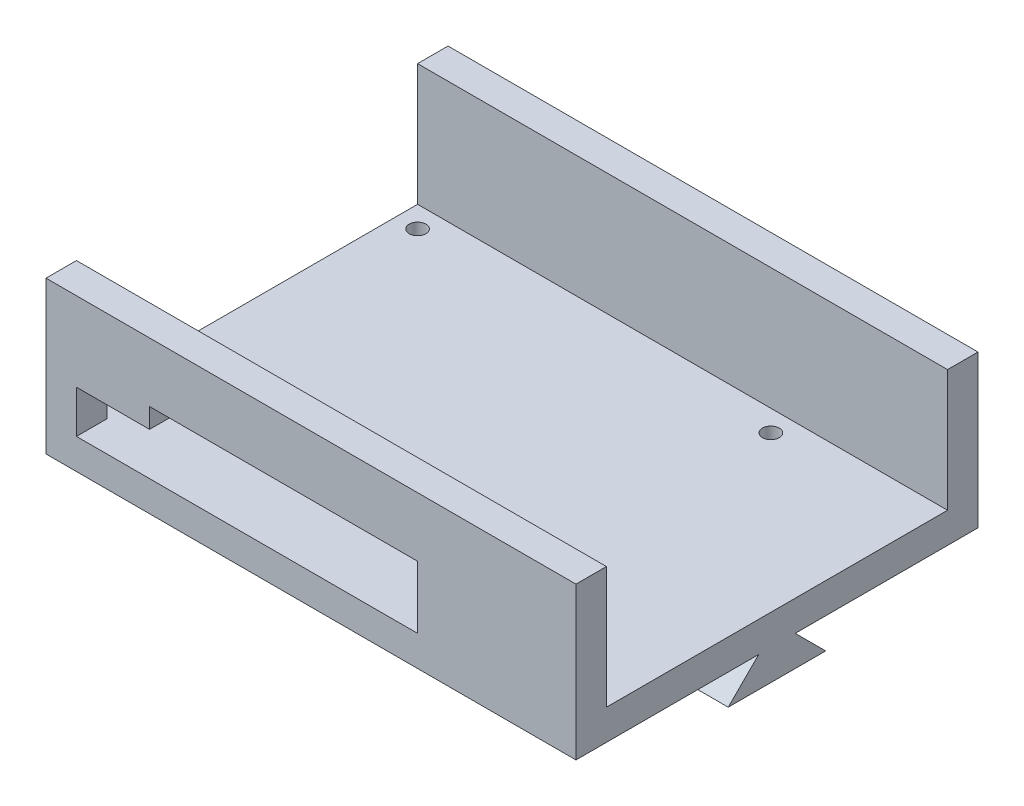
ISO-10303-21;
HEADER;
FILE_DESCRIPTION(('STEP AP214'),'2;1');
FILE_NAME('part.step','',(''),(''),'','','');
FILE_SCHEMA(('AUTOMOTIVE_DESIGN { 1 0 10303 214 1 1 1 1 }'));
ENDSEC;
DATA;
#1=APPLICATION_CONTEXT('core data for automotive mechanical design processes');
#2=APPLICATION_PROTOCOL_DEFINITION('international standard','automotive_design',2000,#1);
#3=PRODUCT_CONTEXT('',#1,'mechanical');
#4=PRODUCT('Part','Part','',(#3));
#5=PRODUCT_RELATED_PRODUCT_CATEGORY('part','',(#4));
#6=PRODUCT_DEFINITION_FORMATION('','',#4);
#7=PRODUCT_DEFINITION_CONTEXT('part definition',#1,'design');
#8=PRODUCT_DEFINITION('design','',#6,#7);
#9=PRODUCT_DEFINITION_SHAPE('','',#8);
#10=(LENGTH_UNIT() NAMED_UNIT(*) SI_UNIT(.MILLI.,.METRE.));
#11=(NAMED_UNIT(*) PLANE_ANGLE_UNIT() SI_UNIT($,.RADIAN.));
#12=(NAMED_UNIT(*) SI_UNIT($,.STERADIAN.) SOLID_ANGLE_UNIT());
#13=UNCERTAINTY_MEASURE_WITH_UNIT(LENGTH_MEASURE(1.E-05),#10,'distance_accuracy_value','');
#14=(GEOMETRIC_REPRESENTATION_CONTEXT(3) GLOBAL_UNCERTAINTY_ASSIGNED_CONTEXT((#13)) GLOBAL_UNIT_ASSIGNED_CONTEXT((#10,
#11,#12)) REPRESENTATION_CONTEXT('',''));
#15=CARTESIAN_POINT('',(0.,0.,0.));
#16=DIRECTION('',(0.,0.,1.));
#17=DIRECTION('',(1.,0.,0.));
#18=AXIS2_PLACEMENT_3D('',#15,#16,#17);
#19=CARTESIAN_POINT('',(0.,10.,0.));
#20=DIRECTION('',(0.,1.,0.));
#21=DIRECTION('',(0.,0.,1.));
#22=AXIS2_PLACEMENT_3D('',#19,#20,#21);
#23=PLANE('',#22);
#24=DIRECTION('',(-1.,0.,0.));
#25=VECTOR('',#24,1.);
#26=CARTESIAN_POINT('',(43.5,9.99999999999982,28.));
#27=LINE('',#26,#25);
#28=CARTESIAN_POINT('',(-38.5,9.99999999999994,28.));
#29=VERTEX_POINT('',#28);
#30=CARTESIAN_POINT('',(-43.5,10.,28.));
#31=VERTEX_POINT('',#30);
#32=EDGE_CURVE('E215',#29,#31,#27,.T.);
#33=ORIENTED_EDGE('',*,*,#32,.F.);
#34=DIRECTION('',(0.,0.,1.));
#35=VECTOR('',#34,1.);
#36=CARTESIAN_POINT('',(-38.5,9.99999999999994,23.));
#37=LINE('',#36,#35);
#38=CARTESIAN_POINT('',(-38.5,9.99999999999993,33.));
#39=VERTEX_POINT('',#38);
#40=EDGE_CURVE('E173',#29,#39,#37,.T.);
#41=ORIENTED_EDGE('',*,*,#40,.T.);
#42=DIRECTION('',(1.,0.,0.));
#43=VECTOR('',#42,1.);
#44=CARTESIAN_POINT('',(17.5,9.99999999999994,33.));
#45=LINE('',#44,#43);
#46=CARTESIAN_POINT('',(17.5,9.99999999999994,33.));
#47=VERTEX_POINT('',#46);
#48=EDGE_CURVE('E170',#39,#47,#45,.T.);
#49=ORIENTED_EDGE('',*,*,#48,.T.);
#50=DIRECTION('',(0.,0.,1.));
#51=VECTOR('',#50,1.);
#52=CARTESIAN_POINT('',(17.5,9.99999999999994,23.));
#53=LINE('',#52,#51);
#54=CARTESIAN_POINT('',(17.5,9.99999999999982,28.));
#55=VERTEX_POINT('',#54);
#56=EDGE_CURVE('E58',#55,#47,#53,.T.);
#57=ORIENTED_EDGE('',*,*,#56,.F.);
#58=CARTESIAN_POINT('',(43.5,10.,28.));
#59=VERTEX_POINT('',#58);
#60=EDGE_CURVE('E216',#59,#55,#27,.T.);
#61=ORIENTED_EDGE('',*,*,#60,.F.);
#62=DIRECTION('',(0.,0.,-1.));
#63=VECTOR('',#62,1.);
#64=CARTESIAN_POINT('',(43.5,10.,-33.));
#65=LINE('',#64,#63);
#66=CARTESIAN_POINT('',(43.5,9.99999999999981,-28.));
#67=VERTEX_POINT('',#66);
#68=EDGE_CURVE('E240',#59,#67,#65,.T.);
#69=ORIENTED_EDGE('',*,*,#68,.T.);
#70=DIRECTION('',(-1.,0.,0.));
#71=VECTOR('',#70,1.);
#72=CARTESIAN_POINT('',(43.5,9.99999999999981,-28.));
#73=LINE('',#72,#71);
#74=CARTESIAN_POINT('',(-43.5,10.,-28.));
#75=VERTEX_POINT('',#74);
#76=EDGE_CURVE('E230',#67,#75,#73,.T.);
#77=ORIENTED_EDGE('',*,*,#76,.T.);
#78=DIRECTION('',(0.,0.,1.));
#79=VECTOR('',#78,1.);
#80=CARTESIAN_POINT('',(-43.5,10.,-33.));
#81=LINE('',#80,#79);
#82=EDGE_CURVE('E243',#75,#31,#81,.T.);
#83=ORIENTED_EDGE('',*,*,#82,.T.);
#84=EDGE_LOOP('',(#33,#41,#49,#57,#61,#69,#77,#83));
#85=FACE_BOUND('',#84,.T.);
#86=CARTESIAN_POINT('',(18.,10.,24.5));
#87=DIRECTION('',(0.,1.,0.));
#88=DIRECTION('',(0.,0.,1.));
#89=AXIS2_PLACEMENT_3D('',#86,#87,#88);
#90=CIRCLE('',#89,1.375);
#91=CARTESIAN_POINT('',(18.,10.,25.875));
#92=VERTEX_POINT('',#91);
#93=EDGE_CURVE('E314',#92,#92,#90,.T.);
#94=ORIENTED_EDGE('',*,*,#93,.F.);
#95=EDGE_LOOP('',(#94));
#96=FACE_BOUND('',#95,.T.);
#97=CARTESIAN_POINT('',(18.,10.,-24.5));
#98=DIRECTION('',(0.,1.,0.));
#99=DIRECTION('',(0.,0.,1.));
#100=AXIS2_PLACEMENT_3D('',#97,#98,#99);
#101=CIRCLE('',#100,1.375);
#102=CARTESIAN_POINT('',(18.,10.,-23.125));
#103=VERTEX_POINT('',#102);
#104=EDGE_CURVE('E331',#103,#103,#101,.T.);
#105=ORIENTED_EDGE('',*,*,#104,.F.);
#106=EDGE_LOOP('',(#105));
#107=FACE_BOUND('',#106,.T.);
#108=CARTESIAN_POINT('',(-40.,10.,-24.5));
#109=DIRECTION('',(0.,1.,0.));
#110=DIRECTION('',(0.,0.,1.));
#111=AXIS2_PLACEMENT_3D('',#108,#109,#110);
#112=CIRCLE('',#111,1.375);
#113=CARTESIAN_POINT('',(-40.,10.,-23.125));
#114=VERTEX_POINT('',#113);
#115=EDGE_CURVE('E249',#114,#114,#112,.T.);
#116=ORIENTED_EDGE('',*,*,#115,.F.);
#117=EDGE_LOOP('',(#116));
#118=FACE_BOUND('',#117,.T.);
#119=CARTESIAN_POINT('',(-40.,10.,24.5));
#120=DIRECTION('',(0.,1.,0.));
#121=DIRECTION('',(0.,0.,1.));
#122=AXIS2_PLACEMENT_3D('',#119,#120,#121);
#123=CIRCLE('',#122,1.375);
#124=CARTESIAN_POINT('',(-40.,10.,25.875));
#125=VERTEX_POINT('',#124);
#126=EDGE_CURVE('E333',#125,#125,#123,.T.);
#127=ORIENTED_EDGE('',*,*,#126,.F.);
#128=EDGE_LOOP('',(#127));
#129=FACE_BOUND('',#128,.T.);
#130=ADVANCED_FACE('F35',(#85,#96,#107,#118,#129),#23,.T.);
#131=CARTESIAN_POINT('',(0.,0.,0.));
#132=DIRECTION('',(0.,1.,0.));
#133=DIRECTION('',(0.,0.,1.));
#134=AXIS2_PLACEMENT_3D('',#131,#132,#133);
#135=PLANE('',#134);
#136=DIRECTION('',(0.,0.,-1.));
#137=VECTOR('',#136,1.);
#138=CARTESIAN_POINT('',(43.5,0.,-33.));
#139=LINE('',#138,#137);
#140=CARTESIAN_POINT('',(43.5,-1.19770966961526E-12,8.00000000000604));
#141=VERTEX_POINT('',#140);
#142=CARTESIAN_POINT('',(43.5,0.,-7.99999999999396));
#143=VERTEX_POINT('',#142);
#144=EDGE_CURVE('E253',#141,#143,#139,.T.);
#145=ORIENTED_EDGE('',*,*,#144,.F.);
#146=DIRECTION('',(1.,0.,0.));
#147=VECTOR('',#146,1.);
#148=CARTESIAN_POINT('',(-43.5,-1.19770966961526E-12,8.00000000000604));
#149=LINE('',#148,#147);
#150=CARTESIAN_POINT('',(-43.5,-1.19770966961526E-12,8.00000000000604));
#151=VERTEX_POINT('',#150);
#152=EDGE_CURVE('E357',#151,#141,#149,.T.);
#153=ORIENTED_EDGE('',*,*,#152,.F.);
#154=DIRECTION('',(0.,0.,1.));
#155=VECTOR('',#154,1.);
#156=CARTESIAN_POINT('',(-43.5,0.,-33.));
#157=LINE('',#156,#155);
#158=CARTESIAN_POINT('',(-43.5,0.,-7.99999999999396));
#159=VERTEX_POINT('',#158);
#160=EDGE_CURVE('E244',#159,#151,#157,.T.);
#161=ORIENTED_EDGE('',*,*,#160,.F.);
#162=DIRECTION('',(1.,0.,0.));
#163=VECTOR('',#162,1.);
#164=CARTESIAN_POINT('',(-43.5,0.,-7.99999999999396));
#165=LINE('',#164,#163);
#166=EDGE_CURVE('E310',#159,#143,#165,.T.);
#167=ORIENTED_EDGE('',*,*,#166,.T.);
#168=EDGE_LOOP('',(#145,#153,#161,#167));
#169=FACE_BOUND('',#168,.T.);
#170=ADVANCED_FACE('F379',(#169),#135,.F.);
#171=CARTESIAN_POINT('',(43.5,10.,-33.));
#172=DIRECTION('',(-1.,0.,0.));
#173=DIRECTION('',(0.,0.,1.));
#174=AXIS2_PLACEMENT_3D('',#171,#172,#173);
#175=PLANE('',#174);
#176=DIRECTION('',(0.,-1.,0.));
#177=VECTOR('',#176,1.);
#178=CARTESIAN_POINT('',(43.5,10.,33.));
#179=LINE('',#178,#177);
#180=CARTESIAN_POINT('',(43.5,30.,33.));
#181=VERTEX_POINT('',#180);
#182=CARTESIAN_POINT('',(43.5,5.,33.));
#183=VERTEX_POINT('',#182);
#184=EDGE_CURVE('E258',#181,#183,#179,.T.);
#185=ORIENTED_EDGE('',*,*,#184,.T.);
#186=DIRECTION('',(0.,0.,1.));
#187=VECTOR('',#186,1.);
#188=CARTESIAN_POINT('',(43.5,5.,33.));
#189=LINE('',#188,#187);
#190=CARTESIAN_POINT('',(43.5,5.,3.));
#191=VERTEX_POINT('',#190);
#192=EDGE_CURVE('E361',#191,#183,#189,.T.);
#193=ORIENTED_EDGE('',*,*,#192,.F.);
#194=DIRECTION('',(0.,0.707106781186205,-0.70710678118689));
#195=VECTOR('',#194,1.);
#196=CARTESIAN_POINT('',(43.5,5.,3.));
#197=LINE('',#196,#195);
#198=EDGE_CURVE('E383',#141,#191,#197,.T.);
#199=ORIENTED_EDGE('',*,*,#198,.F.);
#200=ORIENTED_EDGE('',*,*,#144,.T.);
#201=DIRECTION('',(0.,-0.707106781186975,-0.70710678118612));
#202=VECTOR('',#201,1.);
#203=CARTESIAN_POINT('',(43.5,5.,-3.));
#204=LINE('',#203,#202);
#205=CARTESIAN_POINT('',(43.5,5.,-3.));
#206=VERTEX_POINT('',#205);
#207=EDGE_CURVE('E373',#206,#143,#204,.T.);
#208=ORIENTED_EDGE('',*,*,#207,.F.);
#209=DIRECTION('',(0.,0.,1.));
#210=VECTOR('',#209,1.);
#211=CARTESIAN_POINT('',(43.5,5.,-33.));
#212=LINE('',#211,#210);
#213=CARTESIAN_POINT('',(43.5,5.,-33.));
#214=VERTEX_POINT('',#213);
#215=EDGE_CURVE('E370',#214,#206,#212,.T.);
#216=ORIENTED_EDGE('',*,*,#215,.F.);
#217=DIRECTION('',(0.,-1.,0.));
#218=VECTOR('',#217,1.);
#219=CARTESIAN_POINT('',(43.5,10.,-33.));
#220=LINE('',#219,#218);
#221=CARTESIAN_POINT('',(43.5,30.,-33.));
#222=VERTEX_POINT('',#221);
#223=EDGE_CURVE('E296',#222,#214,#220,.T.);
#224=ORIENTED_EDGE('',*,*,#223,.F.);
#225=DIRECTION('',(0.,0.,1.));
#226=VECTOR('',#225,1.);
#227=CARTESIAN_POINT('',(43.5,30.,-33.));
#228=LINE('',#227,#226);
#229=CARTESIAN_POINT('',(43.5,29.9999999999998,-28.));
#230=VERTEX_POINT('',#229);
#231=EDGE_CURVE('E222',#222,#230,#228,.T.);
#232=ORIENTED_EDGE('',*,*,#231,.T.);
#233=DIRECTION('',(0.,-1.,0.));
#234=VECTOR('',#233,1.);
#235=CARTESIAN_POINT('',(43.5,29.9999999999998,-28.));
#236=LINE('',#235,#234);
#237=EDGE_CURVE('E224',#230,#67,#236,.T.);
#238=ORIENTED_EDGE('',*,*,#237,.T.);
#239=ORIENTED_EDGE('',*,*,#68,.F.);
#240=DIRECTION('',(0.,1.,0.));
#241=VECTOR('',#240,1.);
#242=CARTESIAN_POINT('',(43.5,30.,28.));
#243=LINE('',#242,#241);
#244=CARTESIAN_POINT('',(43.5,30.,28.));
#245=VERTEX_POINT('',#244);
#246=EDGE_CURVE('E205',#59,#245,#243,.T.);
#247=ORIENTED_EDGE('',*,*,#246,.T.);
#248=DIRECTION('',(0.,0.,1.));
#249=VECTOR('',#248,1.);
#250=CARTESIAN_POINT('',(43.5,30.,33.));
#251=LINE('',#250,#249);
#252=EDGE_CURVE('E207',#245,#181,#251,.T.);
#253=ORIENTED_EDGE('',*,*,#252,.T.);
#254=EDGE_LOOP('',(#185,#193,#199,#200,#208,#216,#224,#232,#238,#239,#247,#253));
#255=FACE_BOUND('',#254,.T.);
#256=ADVANCED_FACE('F37',(#255),#175,.F.);
#257=CARTESIAN_POINT('',(-43.5,10.,-33.));
#258=DIRECTION('',(0.,0.,1.));
#259=DIRECTION('',(1.,0.,0.));
#260=AXIS2_PLACEMENT_3D('',#257,#258,#259);
#261=PLANE('',#260);
#262=ORIENTED_EDGE('',*,*,#223,.T.);
#263=DIRECTION('',(1.,0.,0.));
#264=VECTOR('',#263,1.);
#265=CARTESIAN_POINT('',(-43.5,5.,-33.));
#266=LINE('',#265,#264);
#267=CARTESIAN_POINT('',(-43.5,5.,-33.));
#268=VERTEX_POINT('',#267);
#269=EDGE_CURVE('E322',#268,#214,#266,.T.);
#270=ORIENTED_EDGE('',*,*,#269,.F.);
#271=DIRECTION('',(0.,-1.,0.));
#272=VECTOR('',#271,1.);
#273=CARTESIAN_POINT('',(-43.5,10.,-33.));
#274=LINE('',#273,#272);
#275=CARTESIAN_POINT('',(-43.5,30.,-33.));
#276=VERTEX_POINT('',#275);
#277=EDGE_CURVE('E298',#276,#268,#274,.T.);
#278=ORIENTED_EDGE('',*,*,#277,.F.);
#279=DIRECTION('',(-1.,0.,0.));
#280=VECTOR('',#279,1.);
#281=CARTESIAN_POINT('',(43.5,30.,-33.));
#282=LINE('',#281,#280);
#283=EDGE_CURVE('E385',#222,#276,#282,.T.);
#284=ORIENTED_EDGE('',*,*,#283,.F.);
#285=EDGE_LOOP('',(#262,#270,#278,#284));
#286=FACE_BOUND('',#285,.T.);
#287=ADVANCED_FACE('F391',(#286),#261,.F.);
#288=CARTESIAN_POINT('',(-43.5,10.,-33.));
#289=DIRECTION('',(1.,0.,0.));
#290=DIRECTION('',(0.,0.,-1.));
#291=AXIS2_PLACEMENT_3D('',#288,#289,#290);
#292=PLANE('',#291);
#293=DIRECTION('',(0.,0.707106781186205,-0.70710678118689));
#294=VECTOR('',#293,1.);
#295=CARTESIAN_POINT('',(-43.5,5.,3.));
#296=LINE('',#295,#294);
#297=CARTESIAN_POINT('',(-43.5,5.,3.));
#298=VERTEX_POINT('',#297);
#299=EDGE_CURVE('E355',#151,#298,#296,.T.);
#300=ORIENTED_EDGE('',*,*,#299,.T.);
#301=DIRECTION('',(0.,0.,1.));
#302=VECTOR('',#301,1.);
#303=CARTESIAN_POINT('',(-43.5,5.,33.));
#304=LINE('',#303,#302);
#305=CARTESIAN_POINT('',(-43.5,5.,33.));
#306=VERTEX_POINT('',#305);
#307=EDGE_CURVE('E354',#298,#306,#304,.T.);
#308=ORIENTED_EDGE('',*,*,#307,.T.);
#309=DIRECTION('',(0.,-1.,0.));
#310=VECTOR('',#309,1.);
#311=CARTESIAN_POINT('',(-43.5,10.,33.));
#312=LINE('',#311,#310);
#313=CARTESIAN_POINT('',(-43.5,30.,33.));
#314=VERTEX_POINT('',#313);
#315=EDGE_CURVE('E304',#314,#306,#312,.T.);
#316=ORIENTED_EDGE('',*,*,#315,.F.);
#317=DIRECTION('',(0.,0.,1.));
#318=VECTOR('',#317,1.);
#319=CARTESIAN_POINT('',(-43.5,30.,33.));
#320=LINE('',#319,#318);
#321=CARTESIAN_POINT('',(-43.5,30.,28.));
#322=VERTEX_POINT('',#321);
#323=EDGE_CURVE('E202',#322,#314,#320,.T.);
#324=ORIENTED_EDGE('',*,*,#323,.F.);
#325=DIRECTION('',(0.,1.,0.));
#326=VECTOR('',#325,1.);
#327=CARTESIAN_POINT('',(-43.5,30.,28.));
#328=LINE('',#327,#326);
#329=EDGE_CURVE('E192',#31,#322,#328,.T.);
#330=ORIENTED_EDGE('',*,*,#329,.F.);
#331=ORIENTED_EDGE('',*,*,#82,.F.);
#332=DIRECTION('',(0.,-1.,0.));
#333=VECTOR('',#332,1.);
#334=CARTESIAN_POINT('',(-43.5,29.9999999999998,-28.));
#335=LINE('',#334,#333);
#336=CARTESIAN_POINT('',(-43.5,29.9999999999998,-28.));
#337=VERTEX_POINT('',#336);
#338=EDGE_CURVE('E221',#337,#75,#335,.T.);
#339=ORIENTED_EDGE('',*,*,#338,.F.);
#340=DIRECTION('',(0.,0.,1.));
#341=VECTOR('',#340,1.);
#342=CARTESIAN_POINT('',(-43.5,30.,-33.));
#343=LINE('',#342,#341);
#344=EDGE_CURVE('E218',#276,#337,#343,.T.);
#345=ORIENTED_EDGE('',*,*,#344,.F.);
#346=ORIENTED_EDGE('',*,*,#277,.T.);
#347=DIRECTION('',(0.,0.,1.));
#348=VECTOR('',#347,1.);
#349=CARTESIAN_POINT('',(-43.5,5.,-33.));
#350=LINE('',#349,#348);
#351=CARTESIAN_POINT('',(-43.5,5.,-3.));
#352=VERTEX_POINT('',#351);
#353=EDGE_CURVE('E374',#268,#352,#350,.T.);
#354=ORIENTED_EDGE('',*,*,#353,.T.);
#355=DIRECTION('',(0.,-0.707106781186975,-0.70710678118612));
#356=VECTOR('',#355,1.);
#357=CARTESIAN_POINT('',(-43.5,5.,-3.));
#358=LINE('',#357,#356);
#359=EDGE_CURVE('E325',#352,#159,#358,.T.);
#360=ORIENTED_EDGE('',*,*,#359,.T.);
#361=ORIENTED_EDGE('',*,*,#160,.T.);
#362=EDGE_LOOP('',(#300,#308,#316,#324,#330,#331,#339,#345,#346,#354,#360,#361));
#363=FACE_BOUND('',#362,.T.);
#364=ADVANCED_FACE('F273',(#363),#292,.F.);
#365=CARTESIAN_POINT('',(-43.5,10.,33.));
#366=DIRECTION('',(0.,0.,-1.));
#367=DIRECTION('',(-1.,0.,0.));
#368=AXIS2_PLACEMENT_3D('',#365,#366,#367);
#369=PLANE('',#368);
#370=ORIENTED_EDGE('',*,*,#48,.F.);
#371=DIRECTION('',(0.,-1.,0.));
#372=VECTOR('',#371,1.);
#373=CARTESIAN_POINT('',(-38.5,9.99999999999994,33.));
#374=LINE('',#373,#372);
#375=CARTESIAN_POINT('',(-38.5,16.9999999999999,33.));
#376=VERTEX_POINT('',#375);
#377=EDGE_CURVE('E50',#376,#39,#374,.T.);
#378=ORIENTED_EDGE('',*,*,#377,.F.);
#379=DIRECTION('',(-1.,0.,0.));
#380=VECTOR('',#379,1.);
#381=CARTESIAN_POINT('',(-38.5,16.9999999999999,33.));
#382=LINE('',#381,#380);
#383=CARTESIAN_POINT('',(-26.5,16.9999999999999,33.));
#384=VERTEX_POINT('',#383);
#385=EDGE_CURVE('E187',#384,#376,#382,.T.);
#386=ORIENTED_EDGE('',*,*,#385,.F.);
#387=DIRECTION('',(0.,-1.,0.));
#388=VECTOR('',#387,1.);
#389=CARTESIAN_POINT('',(-26.5,16.9999999999999,33.));
#390=LINE('',#389,#388);
#391=CARTESIAN_POINT('',(-26.5,20.2506892649197,33.));
#392=VERTEX_POINT('',#391);
#393=EDGE_CURVE('E182',#392,#384,#390,.T.);
#394=ORIENTED_EDGE('',*,*,#393,.F.);
#395=DIRECTION('',(-1.,0.,0.));
#396=VECTOR('',#395,1.);
#397=CARTESIAN_POINT('',(-26.5,20.2506892649197,33.));
#398=LINE('',#397,#396);
#399=CARTESIAN_POINT('',(17.5,20.2506892649197,33.));
#400=VERTEX_POINT('',#399);
#401=EDGE_CURVE('E180',#400,#392,#398,.T.);
#402=ORIENTED_EDGE('',*,*,#401,.F.);
#403=DIRECTION('',(0.,1.,0.));
#404=VECTOR('',#403,1.);
#405=CARTESIAN_POINT('',(17.5,20.2506892649197,33.));
#406=LINE('',#405,#404);
#407=EDGE_CURVE('E162',#47,#400,#406,.T.);
#408=ORIENTED_EDGE('',*,*,#407,.F.);
#409=EDGE_LOOP('',(#370,#378,#386,#394,#402,#408));
#410=FACE_BOUND('',#409,.T.);
#411=ORIENTED_EDGE('',*,*,#315,.T.);
#412=DIRECTION('',(1.,0.,0.));
#413=VECTOR('',#412,1.);
#414=CARTESIAN_POINT('',(-43.5,5.,33.));
#415=LINE('',#414,#413);
#416=EDGE_CURVE('E350',#306,#183,#415,.T.);
#417=ORIENTED_EDGE('',*,*,#416,.T.);
#418=ORIENTED_EDGE('',*,*,#184,.F.);
#419=DIRECTION('',(-1.,0.,0.));
#420=VECTOR('',#419,1.);
#421=CARTESIAN_POINT('',(43.5,30.,33.));
#422=LINE('',#421,#420);
#423=EDGE_CURVE('E210',#181,#314,#422,.T.);
#424=ORIENTED_EDGE('',*,*,#423,.T.);
#425=EDGE_LOOP('',(#411,#417,#418,#424));
#426=FACE_BOUND('',#425,.T.);
#427=ADVANCED_FACE('F176',(#410,#426),#369,.F.);
#428=CARTESIAN_POINT('',(-40.,10.,-24.5));
#429=DIRECTION('',(0.,-1.,0.));
#430=DIRECTION('',(0.,0.,-1.));
#431=AXIS2_PLACEMENT_3D('',#428,#429,#430);
#432=CYLINDRICAL_SURFACE('',#431,1.375);
#433=CARTESIAN_POINT('',(-40.,5.,-24.5));
#434=DIRECTION('',(0.,1.,0.));
#435=DIRECTION('',(0.,0.,1.));
#436=AXIS2_PLACEMENT_3D('',#433,#434,#435);
#437=CIRCLE('',#436,1.375);
#438=CARTESIAN_POINT('',(-40.,5.,-23.125));
#439=VERTEX_POINT('',#438);
#440=EDGE_CURVE('E309',#439,#439,#437,.T.);
#441=ORIENTED_EDGE('',*,*,#440,.F.);
#442=EDGE_LOOP('',(#441));
#443=FACE_BOUND('',#442,.T.);
#444=ORIENTED_EDGE('',*,*,#115,.T.);
#445=EDGE_LOOP('',(#444));
#446=FACE_BOUND('',#445,.T.);
#447=ADVANCED_FACE('F417',(#443,#446),#432,.F.);
#448=CARTESIAN_POINT('',(-40.,10.,24.5));
#449=DIRECTION('',(0.,-1.,0.));
#450=DIRECTION('',(0.,0.,-1.));
#451=AXIS2_PLACEMENT_3D('',#448,#449,#450);
#452=CYLINDRICAL_SURFACE('',#451,1.375);
#453=CARTESIAN_POINT('',(-40.,5.,24.5));
#454=DIRECTION('',(0.,1.,0.));
#455=DIRECTION('',(0.,0.,1.));
#456=AXIS2_PLACEMENT_3D('',#453,#454,#455);
#457=CIRCLE('',#456,1.375);
#458=CARTESIAN_POINT('',(-40.,5.,25.875));
#459=VERTEX_POINT('',#458);
#460=EDGE_CURVE('E367',#459,#459,#457,.T.);
#461=ORIENTED_EDGE('',*,*,#460,.F.);
#462=EDGE_LOOP('',(#461));
#463=FACE_BOUND('',#462,.T.);
#464=ORIENTED_EDGE('',*,*,#126,.T.);
#465=EDGE_LOOP('',(#464));
#466=FACE_BOUND('',#465,.T.);
#467=ADVANCED_FACE('F444',(#463,#466),#452,.F.);
#468=CARTESIAN_POINT('',(18.,10.,-24.5));
#469=DIRECTION('',(0.,-1.,0.));
#470=DIRECTION('',(0.,0.,-1.));
#471=AXIS2_PLACEMENT_3D('',#468,#469,#470);
#472=CYLINDRICAL_SURFACE('',#471,1.375);
#473=CARTESIAN_POINT('',(18.,5.,-24.5));
#474=DIRECTION('',(0.,1.,0.));
#475=DIRECTION('',(0.,0.,1.));
#476=AXIS2_PLACEMENT_3D('',#473,#474,#475);
#477=CIRCLE('',#476,1.375);
#478=CARTESIAN_POINT('',(18.,5.,-23.125));
#479=VERTEX_POINT('',#478);
#480=EDGE_CURVE('E307',#479,#479,#477,.T.);
#481=ORIENTED_EDGE('',*,*,#480,.F.);
#482=EDGE_LOOP('',(#481));
#483=FACE_BOUND('',#482,.T.);
#484=ORIENTED_EDGE('',*,*,#104,.T.);
#485=EDGE_LOOP('',(#484));
#486=FACE_BOUND('',#485,.T.);
#487=ADVANCED_FACE('F406',(#483,#486),#472,.F.);
#488=CARTESIAN_POINT('',(18.,10.,24.5));
#489=DIRECTION('',(0.,-1.,0.));
#490=DIRECTION('',(0.,0.,-1.));
#491=AXIS2_PLACEMENT_3D('',#488,#489,#490);
#492=CYLINDRICAL_SURFACE('',#491,1.375);
#493=CARTESIAN_POINT('',(18.,5.,24.5));
#494=DIRECTION('',(0.,1.,0.));
#495=DIRECTION('',(0.,0.,1.));
#496=AXIS2_PLACEMENT_3D('',#493,#494,#495);
#497=CIRCLE('',#496,1.375);
#498=CARTESIAN_POINT('',(18.,5.,25.875));
#499=VERTEX_POINT('',#498);
#500=EDGE_CURVE('E259',#499,#499,#497,.T.);
#501=ORIENTED_EDGE('',*,*,#500,.F.);
#502=EDGE_LOOP('',(#501));
#503=FACE_BOUND('',#502,.T.);
#504=ORIENTED_EDGE('',*,*,#93,.T.);
#505=EDGE_LOOP('',(#504));
#506=FACE_BOUND('',#505,.T.);
#507=ADVANCED_FACE('F397',(#503,#506),#492,.F.);
#508=CARTESIAN_POINT('',(-43.5,5.,-3.));
#509=DIRECTION('',(0.,-0.70710678118612,0.707106781186975));
#510=DIRECTION('',(0.,-0.707106781186975,-0.70710678118612));
#511=AXIS2_PLACEMENT_3D('',#508,#509,#510);
#512=PLANE('',#511);
#513=ORIENTED_EDGE('',*,*,#166,.F.);
#514=ORIENTED_EDGE('',*,*,#359,.F.);
#515=DIRECTION('',(1.,0.,0.));
#516=VECTOR('',#515,1.);
#517=CARTESIAN_POINT('',(-43.5,5.,-3.));
#518=LINE('',#517,#516);
#519=EDGE_CURVE('E317',#352,#206,#518,.T.);
#520=ORIENTED_EDGE('',*,*,#519,.T.);
#521=ORIENTED_EDGE('',*,*,#207,.T.);
#522=EDGE_LOOP('',(#513,#514,#520,#521));
#523=FACE_BOUND('',#522,.T.);
#524=ADVANCED_FACE('F395',(#523),#512,.F.);
#525=CARTESIAN_POINT('',(-43.5,5.,-33.));
#526=DIRECTION('',(0.,1.,0.));
#527=DIRECTION('',(0.,0.,1.));
#528=AXIS2_PLACEMENT_3D('',#525,#526,#527);
#529=PLANE('',#528);
#530=ORIENTED_EDGE('',*,*,#440,.T.);
#531=EDGE_LOOP('',(#530));
#532=FACE_BOUND('',#531,.T.);
#533=ORIENTED_EDGE('',*,*,#480,.T.);
#534=EDGE_LOOP('',(#533));
#535=FACE_BOUND('',#534,.T.);
#536=ORIENTED_EDGE('',*,*,#519,.F.);
#537=ORIENTED_EDGE('',*,*,#353,.F.);
#538=ORIENTED_EDGE('',*,*,#269,.T.);
#539=ORIENTED_EDGE('',*,*,#215,.T.);
#540=EDGE_LOOP('',(#536,#537,#538,#539));
#541=FACE_BOUND('',#540,.T.);
#542=ADVANCED_FACE('F394',(#532,#535,#541),#529,.F.);
#543=CARTESIAN_POINT('',(-43.5,5.,33.));
#544=DIRECTION('',(0.,1.,0.));
#545=DIRECTION('',(0.,0.,1.));
#546=AXIS2_PLACEMENT_3D('',#543,#544,#545);
#547=PLANE('',#546);
#548=ORIENTED_EDGE('',*,*,#460,.T.);
#549=EDGE_LOOP('',(#548));
#550=FACE_BOUND('',#549,.T.);
#551=ORIENTED_EDGE('',*,*,#500,.T.);
#552=EDGE_LOOP('',(#551));
#553=FACE_BOUND('',#552,.T.);
#554=ORIENTED_EDGE('',*,*,#416,.F.);
#555=ORIENTED_EDGE('',*,*,#307,.F.);
#556=DIRECTION('',(1.,0.,0.));
#557=VECTOR('',#556,1.);
#558=CARTESIAN_POINT('',(-43.5,5.,3.));
#559=LINE('',#558,#557);
#560=EDGE_CURVE('E359',#298,#191,#559,.T.);
#561=ORIENTED_EDGE('',*,*,#560,.T.);
#562=ORIENTED_EDGE('',*,*,#192,.T.);
#563=EDGE_LOOP('',(#554,#555,#561,#562));
#564=FACE_BOUND('',#563,.T.);
#565=ADVANCED_FACE('F403',(#550,#553,#564),#547,.F.);
#566=CARTESIAN_POINT('',(-43.5,5.,3.));
#567=DIRECTION('',(0.,-0.70710678118689,-0.707106781186205));
#568=DIRECTION('',(0.,0.707106781186205,-0.70710678118689));
#569=AXIS2_PLACEMENT_3D('',#566,#567,#568);
#570=PLANE('',#569);
#571=ORIENTED_EDGE('',*,*,#560,.F.);
#572=ORIENTED_EDGE('',*,*,#299,.F.);
#573=ORIENTED_EDGE('',*,*,#152,.T.);
#574=ORIENTED_EDGE('',*,*,#198,.T.);
#575=EDGE_LOOP('',(#571,#572,#573,#574));
#576=FACE_BOUND('',#575,.T.);
#577=ADVANCED_FACE('F382',(#576),#570,.F.);
#578=CARTESIAN_POINT('',(43.5,30.,-33.));
#579=DIRECTION('',(0.,-1.,0.));
#580=DIRECTION('',(0.,0.,-1.));
#581=AXIS2_PLACEMENT_3D('',#578,#579,#580);
#582=PLANE('',#581);
#583=ORIENTED_EDGE('',*,*,#283,.T.);
#584=ORIENTED_EDGE('',*,*,#344,.T.);
#585=DIRECTION('',(-1.,0.,0.));
#586=VECTOR('',#585,1.);
#587=CARTESIAN_POINT('',(43.5,29.9999999999998,-28.));
#588=LINE('',#587,#586);
#589=EDGE_CURVE('E227',#230,#337,#588,.T.);
#590=ORIENTED_EDGE('',*,*,#589,.F.);
#591=ORIENTED_EDGE('',*,*,#231,.F.);
#592=EDGE_LOOP('',(#583,#584,#590,#591));
#593=FACE_BOUND('',#592,.T.);
#594=ADVANCED_FACE('F390',(#593),#582,.F.);
#595=CARTESIAN_POINT('',(43.5,29.9999999999998,-28.));
#596=DIRECTION('',(0.,0.,-1.));
#597=DIRECTION('',(0.,1.,0.));
#598=AXIS2_PLACEMENT_3D('',#595,#596,#597);
#599=PLANE('',#598);
#600=ORIENTED_EDGE('',*,*,#589,.T.);
#601=ORIENTED_EDGE('',*,*,#338,.T.);
#602=ORIENTED_EDGE('',*,*,#76,.F.);
#603=ORIENTED_EDGE('',*,*,#237,.F.);
#604=EDGE_LOOP('',(#600,#601,#602,#603));
#605=FACE_BOUND('',#604,.T.);
#606=ADVANCED_FACE('F264',(#605),#599,.F.);
#607=CARTESIAN_POINT('',(43.5,30.,28.));
#608=DIRECTION('',(0.,0.,1.));
#609=DIRECTION('',(0.,-1.,0.));
#610=AXIS2_PLACEMENT_3D('',#607,#608,#609);
#611=PLANE('',#610);
#612=DIRECTION('',(-1.,0.,0.));
#613=VECTOR('',#612,1.);
#614=CARTESIAN_POINT('',(43.5,16.9999999999999,28.));
#615=LINE('',#614,#613);
#616=CARTESIAN_POINT('',(-26.5,16.9999999999999,28.));
#617=VERTEX_POINT('',#616);
#618=CARTESIAN_POINT('',(-38.5,16.9999999999999,28.));
#619=VERTEX_POINT('',#618);
#620=EDGE_CURVE('E43',#617,#619,#615,.T.);
#621=ORIENTED_EDGE('',*,*,#620,.T.);
#622=DIRECTION('',(0.,-1.,0.));
#623=VECTOR('',#622,1.);
#624=CARTESIAN_POINT('',(-38.5,30.,28.));
#625=LINE('',#624,#623);
#626=EDGE_CURVE('E11',#619,#29,#625,.T.);
#627=ORIENTED_EDGE('',*,*,#626,.T.);
#628=ORIENTED_EDGE('',*,*,#32,.T.);
#629=ORIENTED_EDGE('',*,*,#329,.T.);
#630=DIRECTION('',(-1.,0.,0.));
#631=VECTOR('',#630,1.);
#632=CARTESIAN_POINT('',(43.5,30.,28.));
#633=LINE('',#632,#631);
#634=EDGE_CURVE('E213',#245,#322,#633,.T.);
#635=ORIENTED_EDGE('',*,*,#634,.F.);
#636=ORIENTED_EDGE('',*,*,#246,.F.);
#637=ORIENTED_EDGE('',*,*,#60,.T.);
#638=DIRECTION('',(0.,1.,0.));
#639=VECTOR('',#638,1.);
#640=CARTESIAN_POINT('',(17.5,30.,28.));
#641=LINE('',#640,#639);
#642=CARTESIAN_POINT('',(17.5,20.2506892649197,28.));
#643=VERTEX_POINT('',#642);
#644=EDGE_CURVE('E165',#55,#643,#641,.T.);
#645=ORIENTED_EDGE('',*,*,#644,.T.);
#646=DIRECTION('',(-1.,0.,0.));
#647=VECTOR('',#646,1.);
#648=CARTESIAN_POINT('',(43.5,20.2506892649197,28.));
#649=LINE('',#648,#647);
#650=CARTESIAN_POINT('',(-26.5,20.2506892649197,28.));
#651=VERTEX_POINT('',#650);
#652=EDGE_CURVE('E295',#643,#651,#649,.T.);
#653=ORIENTED_EDGE('',*,*,#652,.T.);
#654=DIRECTION('',(0.,-1.,0.));
#655=VECTOR('',#654,1.);
#656=CARTESIAN_POINT('',(-26.5,30.,28.));
#657=LINE('',#656,#655);
#658=EDGE_CURVE('E291',#651,#617,#657,.T.);
#659=ORIENTED_EDGE('',*,*,#658,.T.);
#660=EDGE_LOOP('',(#621,#627,#628,#629,#635,#636,#637,#645,#653,#659));
#661=FACE_BOUND('',#660,.T.);
#662=ADVANCED_FACE('F278',(#661),#611,.F.);
#663=CARTESIAN_POINT('',(43.5,30.,33.));
#664=DIRECTION('',(0.,-1.,0.));
#665=DIRECTION('',(0.,0.,-1.));
#666=AXIS2_PLACEMENT_3D('',#663,#664,#665);
#667=PLANE('',#666);
#668=ORIENTED_EDGE('',*,*,#634,.T.);
#669=ORIENTED_EDGE('',*,*,#323,.T.);
#670=ORIENTED_EDGE('',*,*,#423,.F.);
#671=ORIENTED_EDGE('',*,*,#252,.F.);
#672=EDGE_LOOP('',(#668,#669,#670,#671));
#673=FACE_BOUND('',#672,.T.);
#674=ADVANCED_FACE('F511',(#673),#667,.F.);
#675=CARTESIAN_POINT('',(-38.5,9.99999999999994,23.));
#676=DIRECTION('',(-1.,0.,0.));
#677=DIRECTION('',(0.,0.,1.));
#678=AXIS2_PLACEMENT_3D('',#675,#676,#677);
#679=PLANE('',#678);
#680=DIRECTION('',(0.,0.,1.));
#681=VECTOR('',#680,1.);
#682=CARTESIAN_POINT('',(-38.5,16.9999999999999,23.));
#683=LINE('',#682,#681);
#684=EDGE_CURVE('E193',#619,#376,#683,.T.);
#685=ORIENTED_EDGE('',*,*,#684,.T.);
#686=ORIENTED_EDGE('',*,*,#377,.T.);
#687=ORIENTED_EDGE('',*,*,#40,.F.);
#688=ORIENTED_EDGE('',*,*,#626,.F.);
#689=EDGE_LOOP('',(#685,#686,#687,#688));
#690=FACE_BOUND('',#689,.T.);
#691=ADVANCED_FACE('F283',(#690),#679,.F.);
#692=CARTESIAN_POINT('',(-38.5,16.9999999999999,23.));
#693=DIRECTION('',(0.,1.,0.));
#694=DIRECTION('',(0.,0.,1.));
#695=AXIS2_PLACEMENT_3D('',#692,#693,#694);
#696=PLANE('',#695);
#697=DIRECTION('',(0.,0.,1.));
#698=VECTOR('',#697,1.);
#699=CARTESIAN_POINT('',(-26.5,16.9999999999999,23.));
#700=LINE('',#699,#698);
#701=EDGE_CURVE('E195',#617,#384,#700,.T.);
#702=ORIENTED_EDGE('',*,*,#701,.T.);
#703=ORIENTED_EDGE('',*,*,#385,.T.);
#704=ORIENTED_EDGE('',*,*,#684,.F.);
#705=ORIENTED_EDGE('',*,*,#620,.F.);
#706=EDGE_LOOP('',(#702,#703,#704,#705));
#707=FACE_BOUND('',#706,.T.);
#708=ADVANCED_FACE('F285',(#707),#696,.F.);
#709=CARTESIAN_POINT('',(-26.5,16.9999999999999,23.));
#710=DIRECTION('',(-1.,0.,0.));
#711=DIRECTION('',(0.,0.,1.));
#712=AXIS2_PLACEMENT_3D('',#709,#710,#711);
#713=PLANE('',#712);
#714=DIRECTION('',(0.,0.,1.));
#715=VECTOR('',#714,1.);
#716=CARTESIAN_POINT('',(-26.5,20.2506892649197,23.));
#717=LINE('',#716,#715);
#718=EDGE_CURVE('E197',#651,#392,#717,.T.);
#719=ORIENTED_EDGE('',*,*,#718,.T.);
#720=ORIENTED_EDGE('',*,*,#393,.T.);
#721=ORIENTED_EDGE('',*,*,#701,.F.);
#722=ORIENTED_EDGE('',*,*,#658,.F.);
#723=EDGE_LOOP('',(#719,#720,#721,#722));
#724=FACE_BOUND('',#723,.T.);
#725=ADVANCED_FACE('F289',(#724),#713,.F.);
#726=CARTESIAN_POINT('',(-26.5,20.2506892649197,23.));
#727=DIRECTION('',(0.,1.,0.));
#728=DIRECTION('',(0.,0.,1.));
#729=AXIS2_PLACEMENT_3D('',#726,#727,#728);
#730=PLANE('',#729);
#731=DIRECTION('',(0.,0.,1.));
#732=VECTOR('',#731,1.);
#733=CARTESIAN_POINT('',(17.5,20.2506892649197,23.));
#734=LINE('',#733,#732);
#735=EDGE_CURVE('E167',#643,#400,#734,.T.);
#736=ORIENTED_EDGE('',*,*,#735,.T.);
#737=ORIENTED_EDGE('',*,*,#401,.T.);
#738=ORIENTED_EDGE('',*,*,#718,.F.);
#739=ORIENTED_EDGE('',*,*,#652,.F.);
#740=EDGE_LOOP('',(#736,#737,#738,#739));
#741=FACE_BOUND('',#740,.T.);
#742=ADVANCED_FACE('F294',(#741),#730,.F.);
#743=CARTESIAN_POINT('',(17.5,20.2506892649197,23.));
#744=DIRECTION('',(1.,0.,0.));
#745=DIRECTION('',(0.,0.,-1.));
#746=AXIS2_PLACEMENT_3D('',#743,#744,#745);
#747=PLANE('',#746);
#748=ORIENTED_EDGE('',*,*,#56,.T.);
#749=ORIENTED_EDGE('',*,*,#407,.T.);
#750=ORIENTED_EDGE('',*,*,#735,.F.);
#751=ORIENTED_EDGE('',*,*,#644,.F.);
#752=EDGE_LOOP('',(#748,#749,#750,#751));
#753=FACE_BOUND('',#752,.T.);
#754=ADVANCED_FACE('F159',(#753),#747,.F.);
#755=CLOSED_SHELL('',(#130,#170,#256,#287,#364,#427,#447,#467,#487,#507,#524,#542,#565,#577,
#594,#606,#662,#674,#691,#708,#725,#742,#754));
#756=MANIFOLD_SOLID_BREP('B2',#755);
#757=ADVANCED_BREP_SHAPE_REPRESENTATION('',(#18,#756),#14);
#758=SHAPE_DEFINITION_REPRESENTATION(#9,#757);
ENDSEC;
END-ISO-10303-21;
